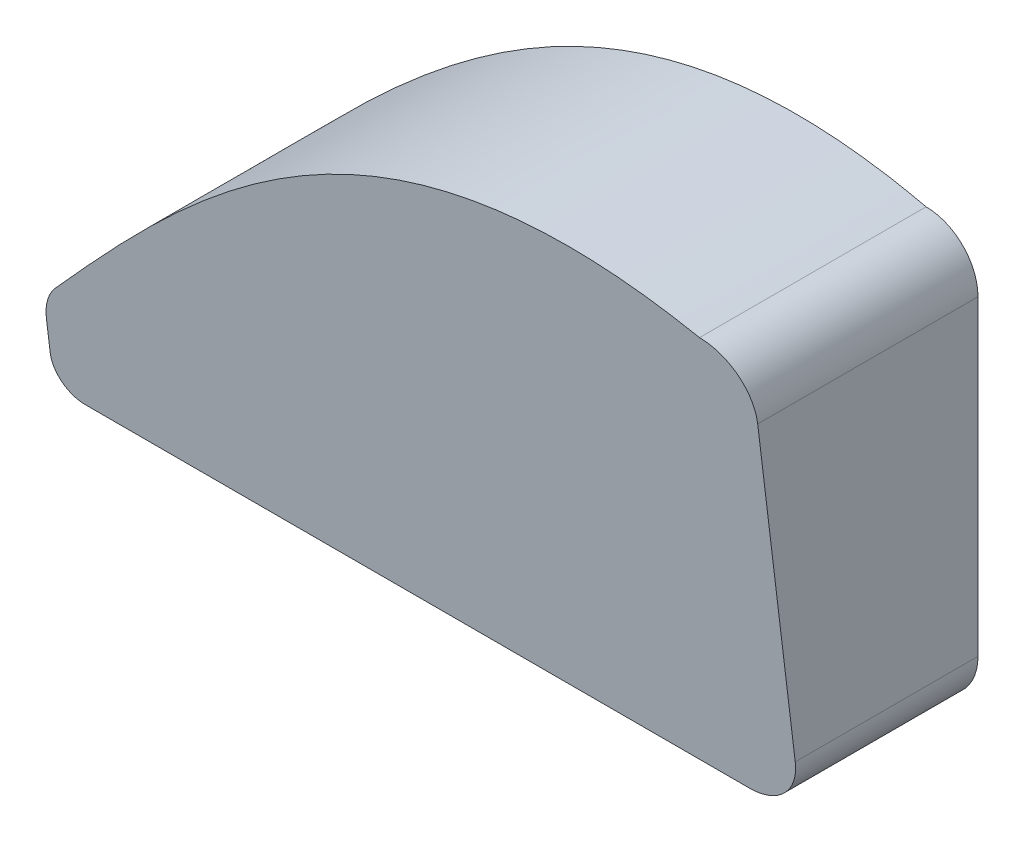
ISO-10303-21;
HEADER;
FILE_DESCRIPTION(('STEP AP214'),'2;1');
FILE_NAME('part.step','',(''),(''),'','','');
FILE_SCHEMA(('AUTOMOTIVE_DESIGN { 1 0 10303 214 1 1 1 1 }'));
ENDSEC;
DATA;
#1=APPLICATION_CONTEXT('core data for automotive mechanical design processes');
#2=APPLICATION_PROTOCOL_DEFINITION('international standard','automotive_design',2000,#1);
#3=PRODUCT_CONTEXT('',#1,'mechanical');
#4=PRODUCT('Part','Part','',(#3));
#5=PRODUCT_RELATED_PRODUCT_CATEGORY('part','',(#4));
#6=PRODUCT_DEFINITION_FORMATION('','',#4);
#7=PRODUCT_DEFINITION_CONTEXT('part definition',#1,'design');
#8=PRODUCT_DEFINITION('design','',#6,#7);
#9=PRODUCT_DEFINITION_SHAPE('','',#8);
#10=(LENGTH_UNIT() NAMED_UNIT(*) SI_UNIT(.MILLI.,.METRE.));
#11=(NAMED_UNIT(*) PLANE_ANGLE_UNIT() SI_UNIT($,.RADIAN.));
#12=(NAMED_UNIT(*) SI_UNIT($,.STERADIAN.) SOLID_ANGLE_UNIT());
#13=UNCERTAINTY_MEASURE_WITH_UNIT(LENGTH_MEASURE(1.E-05),#10,'distance_accuracy_value','');
#14=(GEOMETRIC_REPRESENTATION_CONTEXT(3) GLOBAL_UNCERTAINTY_ASSIGNED_CONTEXT((#13)) GLOBAL_UNIT_ASSIGNED_CONTEXT((#10,
#11,#12)) REPRESENTATION_CONTEXT('',''));
#15=CARTESIAN_POINT('',(0.,0.,0.));
#16=DIRECTION('',(0.,0.,1.));
#17=DIRECTION('',(1.,0.,0.));
#18=AXIS2_PLACEMENT_3D('',#15,#16,#17);
#19=CARTESIAN_POINT('',(54.3030303030303,17.5989547529279,22.));
#20=DIRECTION('',(1.,0.,0.));
#21=DIRECTION('',(0.,1.,0.));
#22=AXIS2_PLACEMENT_3D('',#19,#20,#21);
#23=PLANE('',#22);
#24=DIRECTION('',(0.,0.99281474018445,0.119661571410718));
#25=VECTOR('',#24,1.);
#26=CARTESIAN_POINT('',(54.3030303030303,17.6918648923133,21.2291380197755));
#27=LINE('',#26,#25);
#28=CARTESIAN_POINT('',(54.3030303030303,-12.3966812032091,17.6026379674242));
#29=VERTEX_POINT('',#28);
#30=CARTESIAN_POINT('',(54.3030303030303,17.5989547529279,21.217939784265));
#31=VERTEX_POINT('',#30);
#32=EDGE_CURVE('E232',#29,#31,#27,.T.);
#33=ORIENTED_EDGE('',*,*,#32,.F.);
#34=DIRECTION('',(0.,0.,-1.));
#35=VECTOR('',#34,1.);
#36=CARTESIAN_POINT('',(54.3030303030303,-12.3966812032091,22.));
#37=LINE('',#36,#35);
#38=CARTESIAN_POINT('',(54.3030303030303,-12.3966812032091,0.));
#39=VERTEX_POINT('',#38);
#40=EDGE_CURVE('E42',#29,#39,#37,.T.);
#41=ORIENTED_EDGE('',*,*,#40,.T.);
#42=DIRECTION('',(0.,-1.,0.));
#43=VECTOR('',#42,1.);
#44=CARTESIAN_POINT('',(54.3030303030303,17.5989547529279,0.));
#45=LINE('',#44,#43);
#46=CARTESIAN_POINT('',(54.3030303030303,17.5989547529279,0.));
#47=VERTEX_POINT('',#46);
#48=EDGE_CURVE('E179',#47,#39,#45,.T.);
#49=ORIENTED_EDGE('',*,*,#48,.F.);
#50=DIRECTION('',(0.,0.,-1.));
#51=VECTOR('',#50,1.);
#52=CARTESIAN_POINT('',(54.3030303030303,17.5989547529279,22.));
#53=LINE('',#52,#51);
#54=EDGE_CURVE('E11',#31,#47,#53,.T.);
#55=ORIENTED_EDGE('',*,*,#54,.F.);
#56=EDGE_LOOP('',(#33,#41,#49,#55));
#57=FACE_BOUND('',#56,.T.);
#58=ADVANCED_FACE('F39',(#57),#23,.T.);
#59=CARTESIAN_POINT('',(49.3030303030303,17.5989547529279,22.));
#60=DIRECTION('',(0.,0.,-1.));
#61=DIRECTION('',(-1.,0.,0.));
#62=AXIS2_PLACEMENT_3D('',#59,#60,#61);
#63=CYLINDRICAL_SURFACE('',#62,5.);
#64=DIRECTION('',(0.,0.,-1.));
#65=VECTOR('',#64,1.);
#66=CARTESIAN_POINT('',(49.3030303030303,22.5989547529279,22.));
#67=LINE('',#66,#65);
#68=CARTESIAN_POINT('',(49.3030303030303,22.5989547529279,21.8205777516893));
#69=VERTEX_POINT('',#68);
#70=CARTESIAN_POINT('',(49.3030303030303,22.5989547529279,0.));
#71=VERTEX_POINT('',#70);
#72=EDGE_CURVE('E48',#69,#71,#67,.T.);
#73=ORIENTED_EDGE('',*,*,#72,.F.);
#74=CARTESIAN_POINT('',(49.3030303030303,17.5989547529279,21.217939784265));
#75=DIRECTION('',(0.,0.119661571410718,-0.99281474018445));
#76=DIRECTION('',(0.,-0.99281474018445,-0.119661571410718));
#77=AXIS2_PLACEMENT_3D('',#74,#75,#76);
#78=ELLIPSE('',#77,5.036186307096,5.);
#79=EDGE_CURVE('E214',#69,#31,#78,.T.);
#80=ORIENTED_EDGE('',*,*,#79,.T.);
#81=ORIENTED_EDGE('',*,*,#54,.T.);
#82=CARTESIAN_POINT('',(49.3030303030303,17.5989547529279,0.));
#83=DIRECTION('',(0.,0.,1.));
#84=DIRECTION('',(1.,0.,0.));
#85=AXIS2_PLACEMENT_3D('',#82,#83,#84);
#86=CIRCLE('',#85,5.);
#87=EDGE_CURVE('E149',#47,#71,#86,.T.);
#88=ORIENTED_EDGE('',*,*,#87,.T.);
#89=EDGE_LOOP('',(#73,#80,#81,#88));
#90=FACE_BOUND('',#89,.T.);
#91=ADVANCED_FACE('F202',(#90),#63,.T.);
#92=CARTESIAN_POINT('',(-16.3915471002255,-7.93918414164526,22.));
#93=CARTESIAN_POINT('',(-0.135926549015394,9.90151172230741,22.));
#94=CARTESIAN_POINT('',(18.696906390298,29.7257373747822,22.));
#95=CARTESIAN_POINT('',(49.3030303030303,22.5989547529279,22.));
#96=B_SPLINE_CURVE_WITH_KNOTS('',3,(#92,#93,#94,#95),.UNSPECIFIED.,.F.,.F.,(4,4),
(0.0262995470463997,1.),.UNSPECIFIED.);
#97=DIRECTION('',(0.,0.,-1.));
#98=VECTOR('',#97,1.);
#99=SURFACE_OF_LINEAR_EXTRUSION('',#96,#98);
#100=CARTESIAN_POINT('',(49.3030303030303,22.5989547529279,21.8205777516893));
#101=CARTESIAN_POINT('',(48.7502562966403,22.727674069721,21.8360919811774));
#102=CARTESIAN_POINT('',(48.1956935191239,22.8489065228533,21.8507038370057));
#103=CARTESIAN_POINT('',(47.0827212262123,23.0758162036586,21.8780527147716));
#104=CARTESIAN_POINT('',(46.5243081744895,23.1814763185473,21.8907876741464));
#105=CARTESIAN_POINT('',(45.4042144840436,23.3764384054658,21.9142859853035));
#106=CARTESIAN_POINT('',(44.8425319791307,23.465729841351,21.9250480671895));
#107=CARTESIAN_POINT('',(43.7165023437948,23.6272034950568,21.9445100980819));
#108=CARTESIAN_POINT('',(43.1521544749768,23.6993806489789,21.9532094367487));
#109=CARTESIAN_POINT('',(42.0214026465682,23.8259311241138,21.9684622609711));
#110=CARTESIAN_POINT('',(41.4549985874446,23.8803035715225,21.9750156412092));
#111=CARTESIAN_POINT('',(40.3216424710989,23.9705431844732,21.9858920045951));
#112=CARTESIAN_POINT('',(39.7546929061054,24.0064410828715,21.9902186919002));
#113=CARTESIAN_POINT('',(38.6200267174648,24.0593010542858,21.9965897770465));
#114=CARTESIAN_POINT('',(38.052310305522,24.076267577724,21.9986347112863));
#115=CARTESIAN_POINT('',(36.916752297897,24.0907897433076,22.0003850329563));
#116=CARTESIAN_POINT('',(36.3489107614107,24.0883498676903,22.0000909606197));
#117=CARTESIAN_POINT('',(35.2137410340238,24.063669629768,21.9971163109363));
#118=CARTESIAN_POINT('',(34.6464127802545,24.0414321597805,21.9944360821935));
#119=CARTESIAN_POINT('',(33.512919854661,23.976862144714,21.9866536136663));
#120=CARTESIAN_POINT('',(32.9467551866918,23.9345295331658,21.9815513658704));
#121=CARTESIAN_POINT('',(31.6699384431578,23.8159825796641,21.9672631868499));
#122=CARTESIAN_POINT('',(30.9598363858026,23.7338331167062,21.9573619097735));
#123=CARTESIAN_POINT('',(29.5440465386091,23.5372486702371,21.933668059524));
#124=CARTESIAN_POINT('',(28.838359650085,23.4228073011883,21.9198747167175));
#125=CARTESIAN_POINT('',(27.4329817707585,23.1618549859049,21.8884227621421));
#126=CARTESIAN_POINT('',(26.7332911442797,23.0153421052099,21.8707639172174));
#127=CARTESIAN_POINT('',(25.3414423521239,22.6908015040238,21.8316478195683));
#128=CARTESIAN_POINT('',(24.6492834660312,22.5127768262885,21.8101909335799));
#129=CARTESIAN_POINT('',(23.2753426794687,22.1264921430528,21.7636329703095));
#130=CARTESIAN_POINT('',(22.5935402407182,21.9183040638917,21.738540562136));
#131=CARTESIAN_POINT('',(21.2398010766469,21.4724821376946,21.6848067182486));
#132=CARTESIAN_POINT('',(20.5678641684284,21.2348488373188,21.6561653484225));
#133=CARTESIAN_POINT('',(19.2347353696738,20.7314303675914,21.5954895317504));
#134=CARTESIAN_POINT('',(18.5735442200628,20.4656432664409,21.5634548520694));
#135=CARTESIAN_POINT('',(17.2627192425052,19.907434999063,21.496175352939));
#136=CARTESIAN_POINT('',(16.6130851197042,19.6150145135009,21.4609306155286));
#137=CARTESIAN_POINT('',(15.1108258013286,18.9032400144072,21.3751421480489));
#138=CARTESIAN_POINT('',(14.2628852667179,18.4741153408288,21.3234207838375));
#139=CARTESIAN_POINT('',(12.5889917214329,17.5752103212085,21.2150779250512));
#140=CARTESIAN_POINT('',(11.7630439848626,17.105420335993,21.1584552686899));
#141=CARTESIAN_POINT('',(10.1331168233974,16.129151089689,21.0407878858396));
#142=CARTESIAN_POINT('',(9.3291450160767,15.622659323219,20.9797416521071));
#143=CARTESIAN_POINT('',(7.74309345871204,14.5771257510876,20.8537260067505));
#144=CARTESIAN_POINT('',(6.9610125504577,14.0380856722847,20.7887568032605));
#145=CARTESIAN_POINT('',(5.41171244264686,12.9267924915215,20.654815310527));
#146=CARTESIAN_POINT('',(4.64466140248656,12.3543088922633,20.5858152399989));
#147=CARTESIAN_POINT('',(3.13094468624023,11.1838589137919,20.4447437207993));
#148=CARTESIAN_POINT('',(2.38427332919489,10.585899757565,20.3726731426971));
#149=CARTESIAN_POINT('',(0.909682081992755,9.36769341627887,20.2258456640139));
#150=CARTESIAN_POINT('',(0.181761792727854,8.74744670627428,20.1510888206901));
#151=CARTESIAN_POINT('',(-1.25687884301039,7.48776876388396,19.9992628697279));
#152=CARTESIAN_POINT('',(-1.96760073456889,6.84833926650544,19.9221939712056));
#153=CARTESIAN_POINT('',(-3.48337361965605,5.45195609070207,19.7538912674433));
#154=CARTESIAN_POINT('',(-4.28583475834453,4.69223563065744,19.6623239886729));
#155=CARTESIAN_POINT('',(-5.87295497026198,3.15482296828671,19.4770233402842));
#156=CARTESIAN_POINT('',(-6.65761498081595,2.37713171659236,19.3832900852433));
#157=CARTESIAN_POINT('',(-8.21223926386949,0.807244739964275,19.1940753859071));
#158=CARTESIAN_POINT('',(-8.98220163789361,0.0150471668158765,19.098593718851));
#159=CARTESIAN_POINT('',(-10.4972129025324,-1.5666153202267,18.9079597455825));
#160=CARTESIAN_POINT('',(-11.2424624171822,-2.35589132367553,18.8128302082915));
#161=CARTESIAN_POINT('',(-12.7245556980748,-3.94193910966451,18.6216676854942));
#162=CARTESIAN_POINT('',(-13.4614007094858,-4.73870974906399,18.525634837768));
#163=CARTESIAN_POINT('',(-14.9296528942015,-6.33645200380376,18.3330628087952));
#164=CARTESIAN_POINT('',(-15.6610625981376,-7.13742132379595,18.2365239042013));
#165=CARTESIAN_POINT('',(-16.3915471002255,-7.93918414164526,18.1398893612203));
#166=B_SPLINE_CURVE_WITH_KNOTS('',3,(#100,#101,#102,#103,#104,#105,#106,#107,#108,#109,#110,
#111,#112,#113,#114,#115,#116,#117,#118,#119,#120,#121,#122,#123,#124,#125,#126,#127,#128,#129,
#130,#131,#132,#133,#134,#135,#136,#137,#138,#139,#140,#141,#142,#143,#144,#145,#146,#147,#148,
#149,#150,#151,#152,#153,#154,#155,#156,#157,#158,#159,#160,#161,#162,#163,#164,#165),
.UNSPECIFIED.,.F.,.F.,(4,2,2,2,2,2,2,2,2,2,2,2,2,2,2,2,2,2,2,2,2,2,2,2,2,2,2,2,2,2,2,2,4),(0.,
1.70330109422131,3.40846024581249,5.11471314478556,6.82147027407463,8.52831115358044,
10.2323034089443,11.9358950022544,13.6390931335957,15.3420424780557,17.0449974554447,
19.1889418134228,21.3333104214538,23.4778084072154,25.6220994346961,27.7613589572834,
29.9005787697658,32.0399454619919,34.1792574940857,37.0332210188016,39.8878629000504,
42.7434820576674,45.5989498426299,48.4771791637327,51.3545977927193,54.2319551264443,
57.1090529945695,60.4351827801126,63.7611370186393,67.0875179985389,70.3564755801903,
73.6249423890749,76.8917777983569),.UNSPECIFIED.);
#167=CARTESIAN_POINT('',(36.8494738568547,24.0875951805928,22.));
#168=VERTEX_POINT('',#167);
#169=EDGE_CURVE('E118',#69,#168,#166,.T.);
#170=ORIENTED_EDGE('',*,*,#169,.F.);
#171=ORIENTED_EDGE('',*,*,#72,.T.);
#172=CARTESIAN_POINT('',(-16.3915471002255,-7.93918414164526,0.));
#173=CARTESIAN_POINT('',(-0.135926549015394,9.90151172230741,0.));
#174=CARTESIAN_POINT('',(18.696906390298,29.7257373747822,0.));
#175=CARTESIAN_POINT('',(49.3030303030303,22.5989547529279,0.));
#176=B_SPLINE_CURVE_WITH_KNOTS('',3,(#172,#173,#174,#175),.UNSPECIFIED.,.F.,.F.,(4,4),
(0.0262995470463997,1.),.UNSPECIFIED.);
#177=CARTESIAN_POINT('',(-16.3915471002255,-7.93918414164526,0.));
#178=VERTEX_POINT('',#177);
#179=EDGE_CURVE('E153',#178,#71,#176,.T.);
#180=ORIENTED_EDGE('',*,*,#179,.F.);
#181=DIRECTION('',(0.,0.,-1.));
#182=VECTOR('',#181,1.);
#183=CARTESIAN_POINT('',(-16.3915471002255,-7.93918414164526,22.));
#184=LINE('',#183,#182);
#185=CARTESIAN_POINT('',(-16.3915471002255,-7.93918414164526,18.1398893612203));
#186=VERTEX_POINT('',#185);
#187=EDGE_CURVE('E144',#186,#178,#184,.T.);
#188=ORIENTED_EDGE('',*,*,#187,.F.);
#189=CARTESIAN_POINT('',(36.8494495897904,24.0875951805928,22.));
#190=VERTEX_POINT('',#189);
#191=EDGE_CURVE('E183',#190,#186,#166,.T.);
#192=ORIENTED_EDGE('',*,*,#191,.F.);
#193=EDGE_CURVE('E152',#190,#168,#96,.T.);
#194=ORIENTED_EDGE('',*,*,#193,.T.);
#195=EDGE_LOOP('',(#170,#171,#180,#188,#192,#194));
#196=FACE_BOUND('',#195,.T.);
#197=ADVANCED_FACE('F196',(#196),#99,.T.);
#198=CARTESIAN_POINT('',(-12.6956442418128,-11.3067206390238,22.));
#199=DIRECTION('',(0.,0.,-1.));
#200=DIRECTION('',(-1.,0.,0.));
#201=AXIS2_PLACEMENT_3D('',#198,#199,#200);
#202=CYLINDRICAL_SURFACE('',#201,5.);
#203=CARTESIAN_POINT('',(-12.6956442418128,-11.3067206390238,17.7340082912189));
#204=DIRECTION('',(0.,0.119661571410718,-0.99281474018445));
#205=DIRECTION('',(0.,-0.99281474018445,-0.119661571410718));
#206=AXIS2_PLACEMENT_3D('',#203,#204,#205);
#207=ELLIPSE('',#206,5.036186307096,5.);
#208=CARTESIAN_POINT('',(-17.6956442418128,-11.3067206390238,17.7340082912189));
#209=VERTEX_POINT('',#208);
#210=EDGE_CURVE('E190',#186,#209,#207,.F.);
#211=ORIENTED_EDGE('',*,*,#210,.F.);
#212=ORIENTED_EDGE('',*,*,#187,.T.);
#213=CARTESIAN_POINT('',(-12.6956442418128,-11.3067206390238,0.));
#214=DIRECTION('',(0.,0.,-1.));
#215=DIRECTION('',(-1.,0.,0.));
#216=AXIS2_PLACEMENT_3D('',#213,#214,#215);
#217=CIRCLE('',#216,5.);
#218=CARTESIAN_POINT('',(-17.6956442418128,-11.3067206390238,0.));
#219=VERTEX_POINT('',#218);
#220=EDGE_CURVE('E159',#219,#178,#217,.T.);
#221=ORIENTED_EDGE('',*,*,#220,.F.);
#222=DIRECTION('',(0.,0.,-1.));
#223=VECTOR('',#222,1.);
#224=CARTESIAN_POINT('',(-17.6956442418128,-11.3067206390238,22.));
#225=LINE('',#224,#223);
#226=EDGE_CURVE('E139',#209,#219,#225,.T.);
#227=ORIENTED_EDGE('',*,*,#226,.F.);
#228=EDGE_LOOP('',(#211,#212,#221,#227));
#229=FACE_BOUND('',#228,.T.);
#230=ADVANCED_FACE('F201',(#229),#202,.T.);
#231=CARTESIAN_POINT('',(-17.6956442418128,-11.3067206390238,22.));
#232=DIRECTION('',(1.,0.,0.));
#233=DIRECTION('',(0.,1.,0.));
#234=AXIS2_PLACEMENT_3D('',#231,#232,#233);
#235=PLANE('',#234);
#236=DIRECTION('',(0.,0.,-1.));
#237=VECTOR('',#236,1.);
#238=CARTESIAN_POINT('',(-17.6956442418128,-14.3966812032091,22.));
#239=LINE('',#238,#237);
#240=CARTESIAN_POINT('',(-17.6956442418128,-14.3966812032091,17.3615827804545));
#241=VERTEX_POINT('',#240);
#242=CARTESIAN_POINT('',(-17.6956442418128,-14.3966812032091,0.));
#243=VERTEX_POINT('',#242);
#244=EDGE_CURVE('E135',#241,#243,#239,.T.);
#245=ORIENTED_EDGE('',*,*,#244,.F.);
#246=DIRECTION('',(0.,0.99281474018445,0.119661571410718));
#247=VECTOR('',#246,1.);
#248=CARTESIAN_POINT('',(-17.6956442418128,-10.7999132649811,17.7950925643726));
#249=LINE('',#248,#247);
#250=EDGE_CURVE('E113',#241,#209,#249,.T.);
#251=ORIENTED_EDGE('',*,*,#250,.T.);
#252=ORIENTED_EDGE('',*,*,#226,.T.);
#253=DIRECTION('',(0.,-1.,0.));
#254=VECTOR('',#253,1.);
#255=CARTESIAN_POINT('',(-17.6956442418128,-11.3067206390238,0.));
#256=LINE('',#255,#254);
#257=EDGE_CURVE('E166',#219,#243,#256,.T.);
#258=ORIENTED_EDGE('',*,*,#257,.T.);
#259=EDGE_LOOP('',(#245,#251,#252,#258));
#260=FACE_BOUND('',#259,.T.);
#261=ADVANCED_FACE('F255',(#260),#235,.F.);
#262=CARTESIAN_POINT('',(-14.6956442418128,-14.3966812032091,22.));
#263=DIRECTION('',(0.,0.,-1.));
#264=DIRECTION('',(-1.,0.,0.));
#265=AXIS2_PLACEMENT_3D('',#262,#263,#264);
#266=CYLINDRICAL_SURFACE('',#265,3.);
#267=CARTESIAN_POINT('',(-14.6956442418128,-14.3966812032091,17.3615827804545));
#268=DIRECTION('',(0.,0.119661571410718,-0.99281474018445));
#269=DIRECTION('',(0.,-0.99281474018445,-0.119661571410718));
#270=AXIS2_PLACEMENT_3D('',#267,#268,#269);
#271=ELLIPSE('',#270,3.0217117842576,3.);
#272=CARTESIAN_POINT('',(-14.6956442418127,-17.3966812032091,17.));
#273=VERTEX_POINT('',#272);
#274=EDGE_CURVE('E110',#241,#273,#271,.F.);
#275=ORIENTED_EDGE('',*,*,#274,.F.);
#276=ORIENTED_EDGE('',*,*,#244,.T.);
#277=CARTESIAN_POINT('',(-14.6956442418128,-14.3966812032091,0.));
#278=DIRECTION('',(0.,0.,-1.));
#279=DIRECTION('',(-1.,0.,0.));
#280=AXIS2_PLACEMENT_3D('',#277,#278,#279);
#281=CIRCLE('',#280,3.);
#282=CARTESIAN_POINT('',(-14.6956442418127,-17.3966812032091,0.));
#283=VERTEX_POINT('',#282);
#284=EDGE_CURVE('E132',#283,#243,#281,.T.);
#285=ORIENTED_EDGE('',*,*,#284,.F.);
#286=DIRECTION('',(0.,0.,-1.));
#287=VECTOR('',#286,1.);
#288=CARTESIAN_POINT('',(-14.6956442418127,-17.3966812032091,22.));
#289=LINE('',#288,#287);
#290=EDGE_CURVE('E124',#273,#283,#289,.T.);
#291=ORIENTED_EDGE('',*,*,#290,.F.);
#292=EDGE_LOOP('',(#275,#276,#285,#291));
#293=FACE_BOUND('',#292,.T.);
#294=ADVANCED_FACE('F130',(#293),#266,.T.);
#295=CARTESIAN_POINT('',(49.3030303030303,-17.3966812032091,22.));
#296=DIRECTION('',(0.,-1.,0.));
#297=DIRECTION('',(0.,0.,-1.));
#298=AXIS2_PLACEMENT_3D('',#295,#296,#297);
#299=PLANE('',#298);
#300=DIRECTION('',(-1.,0.,0.));
#301=VECTOR('',#300,1.);
#302=CARTESIAN_POINT('',(176.601471176903,-17.3966812032091,17.));
#303=LINE('',#302,#301);
#304=CARTESIAN_POINT('',(49.3030303030303,-17.3966812032091,17.));
#305=VERTEX_POINT('',#304);
#306=EDGE_CURVE('E56',#305,#273,#303,.T.);
#307=ORIENTED_EDGE('',*,*,#306,.T.);
#308=ORIENTED_EDGE('',*,*,#290,.T.);
#309=DIRECTION('',(-1.,0.,0.));
#310=VECTOR('',#309,1.);
#311=CARTESIAN_POINT('',(49.3030303030303,-17.3966812032091,0.));
#312=LINE('',#311,#310);
#313=CARTESIAN_POINT('',(49.3030303030303,-17.3966812032091,0.));
#314=VERTEX_POINT('',#313);
#315=EDGE_CURVE('E172',#314,#283,#312,.T.);
#316=ORIENTED_EDGE('',*,*,#315,.F.);
#317=DIRECTION('',(0.,0.,-1.));
#318=VECTOR('',#317,1.);
#319=CARTESIAN_POINT('',(49.3030303030303,-17.3966812032091,22.));
#320=LINE('',#319,#318);
#321=EDGE_CURVE('E126',#305,#314,#320,.T.);
#322=ORIENTED_EDGE('',*,*,#321,.F.);
#323=EDGE_LOOP('',(#307,#308,#316,#322));
#324=FACE_BOUND('',#323,.T.);
#325=ADVANCED_FACE('F122',(#324),#299,.T.);
#326=CARTESIAN_POINT('',(49.3030303030303,-12.3966812032091,22.));
#327=DIRECTION('',(0.,0.,-1.));
#328=DIRECTION('',(-1.,0.,0.));
#329=AXIS2_PLACEMENT_3D('',#326,#327,#328);
#330=CYLINDRICAL_SURFACE('',#329,4.99999999999999);
#331=ORIENTED_EDGE('',*,*,#40,.F.);
#332=CARTESIAN_POINT('',(49.3030303030303,-12.3966812032091,17.6026379674242));
#333=DIRECTION('',(0.,0.119661571410718,-0.99281474018445));
#334=DIRECTION('',(0.,-0.99281474018445,-0.119661571410718));
#335=AXIS2_PLACEMENT_3D('',#332,#333,#334);
#336=ELLIPSE('',#335,5.03618630709599,4.99999999999999);
#337=EDGE_CURVE('E128',#29,#305,#336,.T.);
#338=ORIENTED_EDGE('',*,*,#337,.T.);
#339=ORIENTED_EDGE('',*,*,#321,.T.);
#340=CARTESIAN_POINT('',(49.3030303030303,-12.3966812032091,0.));
#341=DIRECTION('',(0.,0.,1.));
#342=DIRECTION('',(1.,0.,0.));
#343=AXIS2_PLACEMENT_3D('',#340,#341,#342);
#344=CIRCLE('',#343,4.99999999999999);
#345=EDGE_CURVE('E175',#314,#39,#344,.T.);
#346=ORIENTED_EDGE('',*,*,#345,.T.);
#347=EDGE_LOOP('',(#331,#338,#339,#346));
#348=FACE_BOUND('',#347,.T.);
#349=ADVANCED_FACE('F220',(#348),#330,.T.);
#350=CARTESIAN_POINT('',(49.3030303030303,-12.3966812032091,0.));
#351=DIRECTION('',(0.,0.,1.));
#352=DIRECTION('',(1.,0.,0.));
#353=AXIS2_PLACEMENT_3D('',#350,#351,#352);
#354=PLANE('',#353);
#355=ORIENTED_EDGE('',*,*,#48,.T.);
#356=ORIENTED_EDGE('',*,*,#345,.F.);
#357=ORIENTED_EDGE('',*,*,#315,.T.);
#358=ORIENTED_EDGE('',*,*,#284,.T.);
#359=ORIENTED_EDGE('',*,*,#257,.F.);
#360=ORIENTED_EDGE('',*,*,#220,.T.);
#361=ORIENTED_EDGE('',*,*,#179,.T.);
#362=ORIENTED_EDGE('',*,*,#87,.F.);
#363=EDGE_LOOP('',(#355,#356,#357,#358,#359,#360,#361,#362));
#364=FACE_BOUND('',#363,.T.);
#365=ADVANCED_FACE('F218',(#364),#354,.F.);
#366=CARTESIAN_POINT('',(176.601471176903,24.0875951805928,22.));
#367=DIRECTION('',(0.,0.119661571410718,-0.99281474018445));
#368=DIRECTION('',(0.,0.99281474018445,0.119661571410718));
#369=AXIS2_PLACEMENT_3D('',#366,#367,#368);
#370=PLANE('',#369);
#371=ORIENTED_EDGE('',*,*,#193,.F.);
#372=ORIENTED_EDGE('',*,*,#191,.T.);
#373=ORIENTED_EDGE('',*,*,#210,.T.);
#374=ORIENTED_EDGE('',*,*,#250,.F.);
#375=ORIENTED_EDGE('',*,*,#274,.T.);
#376=ORIENTED_EDGE('',*,*,#306,.F.);
#377=ORIENTED_EDGE('',*,*,#337,.F.);
#378=ORIENTED_EDGE('',*,*,#32,.T.);
#379=ORIENTED_EDGE('',*,*,#79,.F.);
#380=ORIENTED_EDGE('',*,*,#169,.T.);
#381=EDGE_LOOP('',(#371,#372,#373,#374,#375,#376,#377,#378,#379,#380));
#382=FACE_BOUND('',#381,.T.);
#383=ADVANCED_FACE('F111',(#382),#370,.F.);
#384=CLOSED_SHELL('',(#58,#91,#197,#230,#261,#294,#325,#349,#365,#383));
#385=MANIFOLD_SOLID_BREP('B2',#384);
#386=ADVANCED_BREP_SHAPE_REPRESENTATION('',(#18,#385),#14);
#387=SHAPE_DEFINITION_REPRESENTATION(#9,#386);
ENDSEC;
END-ISO-10303-21;
